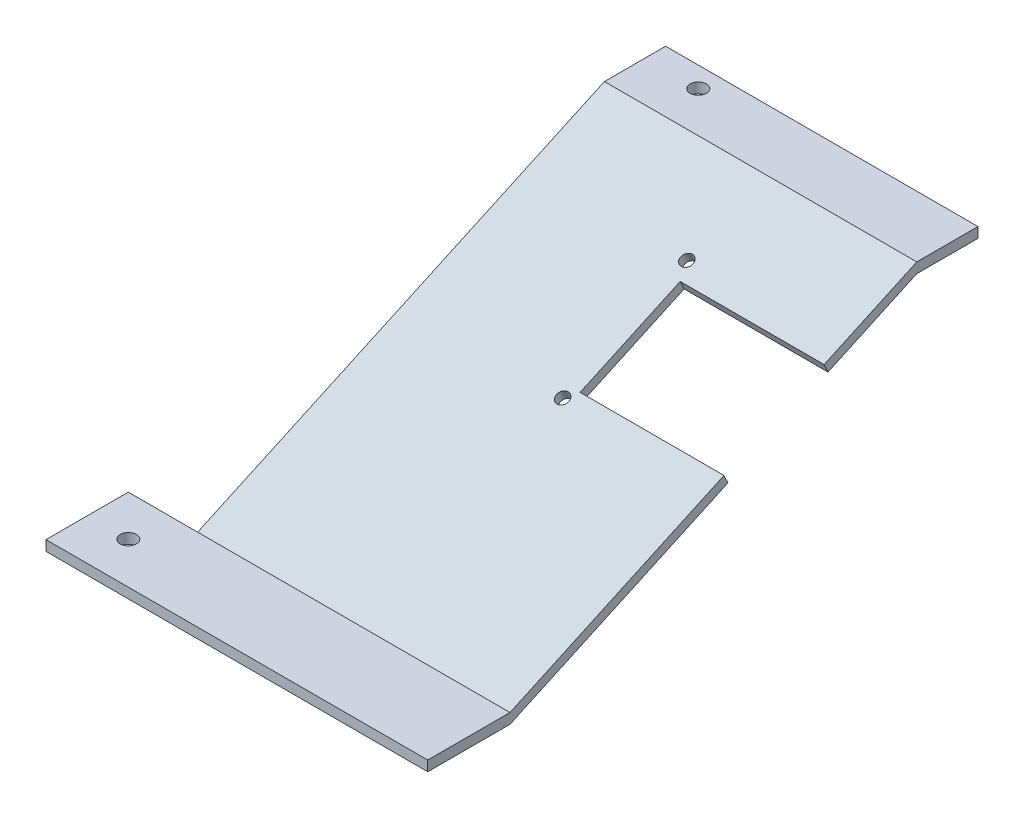
ISO-10303-21;
HEADER;
FILE_DESCRIPTION(('STEP AP214'),'2;1');
FILE_NAME('part.step','',(''),(''),'','','');
FILE_SCHEMA(('AUTOMOTIVE_DESIGN { 1 0 10303 214 1 1 1 1 }'));
ENDSEC;
DATA;
#1=APPLICATION_CONTEXT('core data for automotive mechanical design processes');
#2=APPLICATION_PROTOCOL_DEFINITION('international standard','automotive_design',2000,#1);
#3=PRODUCT_CONTEXT('',#1,'mechanical');
#4=PRODUCT('Part','Part','',(#3));
#5=PRODUCT_RELATED_PRODUCT_CATEGORY('part','',(#4));
#6=PRODUCT_DEFINITION_FORMATION('','',#4);
#7=PRODUCT_DEFINITION_CONTEXT('part definition',#1,'design');
#8=PRODUCT_DEFINITION('design','',#6,#7);
#9=PRODUCT_DEFINITION_SHAPE('','',#8);
#10=(LENGTH_UNIT() NAMED_UNIT(*) SI_UNIT(.MILLI.,.METRE.));
#11=(NAMED_UNIT(*) PLANE_ANGLE_UNIT() SI_UNIT($,.RADIAN.));
#12=(NAMED_UNIT(*) SI_UNIT($,.STERADIAN.) SOLID_ANGLE_UNIT());
#13=UNCERTAINTY_MEASURE_WITH_UNIT(LENGTH_MEASURE(1.E-05),#10,'distance_accuracy_value','');
#14=(GEOMETRIC_REPRESENTATION_CONTEXT(3) GLOBAL_UNCERTAINTY_ASSIGNED_CONTEXT((#13)) GLOBAL_UNIT_ASSIGNED_CONTEXT((#10,
#11,#12)) REPRESENTATION_CONTEXT('',''));
#15=CARTESIAN_POINT('',(0.,0.,0.));
#16=DIRECTION('',(0.,0.,1.));
#17=DIRECTION('',(1.,0.,0.));
#18=AXIS2_PLACEMENT_3D('',#15,#16,#17);
#19=CARTESIAN_POINT('',(19.,0.,0.));
#20=DIRECTION('',(1.,0.,0.));
#21=DIRECTION('',(0.,0.,-1.));
#22=AXIS2_PLACEMENT_3D('',#19,#20,#21);
#23=PLANE('',#22);
#24=DIRECTION('',(0.,-1.,0.));
#25=VECTOR('',#24,1.);
#26=CARTESIAN_POINT('',(19.,2.5,-43.8786351115675));
#27=LINE('',#26,#25);
#28=CARTESIAN_POINT('',(19.,2.5,-43.8786351115675));
#29=VERTEX_POINT('',#28);
#30=CARTESIAN_POINT('',(19.,0.,-43.8786351115675));
#31=VERTEX_POINT('',#30);
#32=EDGE_CURVE('E356',#29,#31,#27,.T.);
#33=ORIENTED_EDGE('',*,*,#32,.F.);
#34=DIRECTION('',(0.,0.,-1.));
#35=VECTOR('',#34,1.);
#36=CARTESIAN_POINT('',(19.,2.5,0.));
#37=LINE('',#36,#35);
#38=CARTESIAN_POINT('',(19.,2.5,-28.8786351115675));
#39=VERTEX_POINT('',#38);
#40=EDGE_CURVE('E158',#39,#29,#37,.T.);
#41=ORIENTED_EDGE('',*,*,#40,.F.);
#42=DIRECTION('',(0.,-0.417404580489355,0.908720758091563));
#43=VECTOR('',#42,1.);
#44=CARTESIAN_POINT('',(19.,-8.88935424437403,-4.0831654236519));
#45=LINE('',#44,#43);
#46=CARTESIAN_POINT('',(19.,-7.93511451223392,-6.16061615927836));
#47=VERTEX_POINT('',#46);
#48=EDGE_CURVE('E344',#39,#47,#45,.T.);
#49=ORIENTED_EDGE('',*,*,#48,.T.);
#50=DIRECTION('',(0.,0.908720758091563,0.417404580489355));
#51=VECTOR('',#50,1.);
#52=CARTESIAN_POINT('',(19.,-26.1095296740652,-14.5087077690655));
#53=LINE('',#52,#51);
#54=CARTESIAN_POINT('',(19.,-9.99956608186571,-7.1088849576851));
#55=VERTEX_POINT('',#54);
#56=EDGE_CURVE('E168',#55,#47,#53,.T.);
#57=ORIENTED_EDGE('',*,*,#56,.F.);
#58=DIRECTION('',(0.,-0.417405333068852,0.908720412407293));
#59=VECTOR('',#58,1.);
#60=CARTESIAN_POINT('',(19.,-10.953803367583,-5.03144408399996));
#61=LINE('',#60,#59);
#62=CARTESIAN_POINT('',(19.,0.,-28.8786351115675));
#63=VERTEX_POINT('',#62);
#64=EDGE_CURVE('E348',#63,#55,#61,.T.);
#65=ORIENTED_EDGE('',*,*,#64,.F.);
#66=DIRECTION('',(0.,0.,-1.));
#67=VECTOR('',#66,1.);
#68=CARTESIAN_POINT('',(19.,0.,0.));
#69=LINE('',#68,#67);
#70=EDGE_CURVE('E176',#63,#31,#69,.T.);
#71=ORIENTED_EDGE('',*,*,#70,.T.);
#72=EDGE_LOOP('',(#33,#41,#49,#57,#65,#71));
#73=FACE_BOUND('',#72,.T.);
#74=ADVANCED_FACE('F34',(#73),#23,.T.);
#75=CARTESIAN_POINT('',(19.,-19.2050381854465,18.3748443091939));
#76=VERTEX_POINT('',#75);
#77=CARTESIAN_POINT('',(19.,-43.3,70.8313648884325));
#78=VERTEX_POINT('',#77);
#79=EDGE_CURVE('E349',#76,#78,#45,.T.);
#80=ORIENTED_EDGE('',*,*,#79,.T.);
#81=DIRECTION('',(0.,0.,1.));
#82=VECTOR('',#81,1.);
#83=CARTESIAN_POINT('',(19.,-43.3,0.));
#84=LINE('',#83,#82);
#85=CARTESIAN_POINT('',(19.,-43.3,91.));
#86=VERTEX_POINT('',#85);
#87=EDGE_CURVE('E173',#78,#86,#84,.T.);
#88=ORIENTED_EDGE('',*,*,#87,.T.);
#89=DIRECTION('',(0.,1.,0.));
#90=VECTOR('',#89,1.);
#91=CARTESIAN_POINT('',(19.,0.,91.));
#92=LINE('',#91,#90);
#93=CARTESIAN_POINT('',(19.,-45.8001,91.));
#94=VERTEX_POINT('',#93);
#95=EDGE_CURVE('E164',#94,#86,#92,.T.);
#96=ORIENTED_EDGE('',*,*,#95,.F.);
#97=DIRECTION('',(0.,0.,1.));
#98=VECTOR('',#97,1.);
#99=CARTESIAN_POINT('',(19.,-45.8001,0.));
#100=LINE('',#99,#98);
#101=CARTESIAN_POINT('',(19.,-45.8001,70.8313648884325));
#102=VERTEX_POINT('',#101);
#103=EDGE_CURVE('E145',#102,#94,#100,.T.);
#104=ORIENTED_EDGE('',*,*,#103,.F.);
#105=CARTESIAN_POINT('',(19.,-21.2695100747286,17.4265661773202));
#106=VERTEX_POINT('',#105);
#107=EDGE_CURVE('E355',#106,#102,#61,.T.);
#108=ORIENTED_EDGE('',*,*,#107,.F.);
#109=DIRECTION('',(0.,-0.908720758091563,-0.417404580489355));
#110=VECTOR('',#109,1.);
#111=CARTESIAN_POINT('',(19.,-37.3794533472778,10.0267526994068));
#112=LINE('',#111,#110);
#113=EDGE_CURVE('E180',#76,#106,#112,.T.);
#114=ORIENTED_EDGE('',*,*,#113,.F.);
#115=EDGE_LOOP('',(#80,#88,#96,#104,#108,#114));
#116=FACE_BOUND('',#115,.T.);
#117=ADVANCED_FACE('F171',(#116),#23,.T.);
#118=CARTESIAN_POINT('',(0.,0.,91.));
#119=DIRECTION('',(0.,0.,1.));
#120=DIRECTION('',(1.,0.,0.));
#121=AXIS2_PLACEMENT_3D('',#118,#119,#120);
#122=PLANE('',#121);
#123=ORIENTED_EDGE('',*,*,#95,.T.);
#124=DIRECTION('',(-1.,0.,0.));
#125=VECTOR('',#124,1.);
#126=CARTESIAN_POINT('',(0.,-43.3,91.));
#127=LINE('',#126,#125);
#128=CARTESIAN_POINT('',(-74.5662608185419,-43.3,91.));
#129=VERTEX_POINT('',#128);
#130=EDGE_CURVE('E321',#86,#129,#127,.T.);
#131=ORIENTED_EDGE('',*,*,#130,.T.);
#132=DIRECTION('',(0.,-1.,0.));
#133=VECTOR('',#132,1.);
#134=CARTESIAN_POINT('',(-74.5662608185419,-43.3,91.));
#135=LINE('',#134,#133);
#136=CARTESIAN_POINT('',(-74.5662608185419,-45.8001,91.));
#137=VERTEX_POINT('',#136);
#138=EDGE_CURVE('E166',#129,#137,#135,.T.);
#139=ORIENTED_EDGE('',*,*,#138,.T.);
#140=DIRECTION('',(-1.,0.,0.));
#141=VECTOR('',#140,1.);
#142=CARTESIAN_POINT('',(0.,-45.8001,91.));
#143=LINE('',#142,#141);
#144=EDGE_CURVE('E149',#94,#137,#143,.T.);
#145=ORIENTED_EDGE('',*,*,#144,.F.);
#146=EDGE_LOOP('',(#123,#131,#139,#145));
#147=FACE_BOUND('',#146,.T.);
#148=ADVANCED_FACE('F162',(#147),#122,.T.);
#149=CARTESIAN_POINT('',(-18.2712608185419,-38.4229647985012,12.2985545946357));
#150=DIRECTION('',(0.,0.908720758091563,0.417404580489355));
#151=DIRECTION('',(0.,-0.417404580489355,0.908720758091563));
#152=AXIS2_PLACEMENT_3D('',#149,#150,#151);
#153=CYLINDRICAL_SURFACE('',#152,1.5);
#154=CARTESIAN_POINT('',(-18.2712608185419,-22.3130234074011,19.6983672083392));
#155=DIRECTION('',(0.,-0.908720412407293,-0.417405333068852));
#156=DIRECTION('',(0.,0.417405333068852,-0.908720412407293));
#157=AXIS2_PLACEMENT_3D('',#154,#155,#156);
#158=CIRCLE('',#157,1.5);
#159=CARTESIAN_POINT('',(-18.2712608185419,-21.6869154077978,18.3352865897283));
#160=VERTEX_POINT('',#159);
#161=EDGE_CURVE('E248',#160,#160,#158,.T.);
#162=ORIENTED_EDGE('',*,*,#161,.T.);
#163=EDGE_LOOP('',(#162));
#164=FACE_BOUND('',#163,.T.);
#165=CARTESIAN_POINT('',(-18.2712608185419,-20.2485496366699,20.6466462044228));
#166=DIRECTION('',(0.,0.908720758091563,0.417404580489355));
#167=DIRECTION('',(0.,-0.417404580489355,0.908720758091563));
#168=AXIS2_PLACEMENT_3D('',#165,#166,#167);
#169=CIRCLE('',#168,1.5);
#170=CARTESIAN_POINT('',(-18.2712608185419,-20.8746565074039,22.0097273415601));
#171=VERTEX_POINT('',#170);
#172=EDGE_CURVE('E11',#171,#171,#169,.T.);
#173=ORIENTED_EDGE('',*,*,#172,.T.);
#174=EDGE_LOOP('',(#173));
#175=FACE_BOUND('',#174,.T.);
#176=ADVANCED_FACE('F403',(#164,#175),#153,.F.);
#177=CARTESIAN_POINT('',(-18.2712608185419,-24.4399113521078,-18.1435908014317));
#178=DIRECTION('',(0.,0.908720758091563,0.417404580489355));
#179=DIRECTION('',(0.,-0.417404580489355,0.908720758091563));
#180=AXIS2_PLACEMENT_3D('',#177,#178,#179);
#181=CYLINDRICAL_SURFACE('',#180,1.5);
#182=CARTESIAN_POINT('',(-18.2712608185419,-8.32994474958973,-10.7437666073155));
#183=DIRECTION('',(0.,-0.908720412407293,-0.417405333068852));
#184=DIRECTION('',(0.,0.417405333068852,-0.908720412407293));
#185=AXIS2_PLACEMENT_3D('',#182,#183,#184);
#186=CIRCLE('',#185,1.5);
#187=CARTESIAN_POINT('',(-18.2712608185419,-7.70383674998645,-12.1068472259264));
#188=VERTEX_POINT('',#187);
#189=EDGE_CURVE('E251',#188,#188,#186,.T.);
#190=ORIENTED_EDGE('',*,*,#189,.T.);
#191=EDGE_LOOP('',(#190));
#192=FACE_BOUND('',#191,.T.);
#193=CARTESIAN_POINT('',(-18.2712608185419,-6.26549619027649,-9.7954991916446));
#194=DIRECTION('',(0.,0.908720758091563,0.417404580489355));
#195=DIRECTION('',(0.,-0.417404580489355,0.908720758091563));
#196=AXIS2_PLACEMENT_3D('',#193,#194,#195);
#197=CIRCLE('',#196,1.5);
#198=CARTESIAN_POINT('',(-18.2712608185419,-6.89160306101053,-8.43241805450726));
#199=VERTEX_POINT('',#198);
#200=EDGE_CURVE('E43',#199,#199,#197,.T.);
#201=ORIENTED_EDGE('',*,*,#200,.T.);
#202=EDGE_LOOP('',(#201));
#203=FACE_BOUND('',#202,.T.);
#204=ADVANCED_FACE('F405',(#192,#203),#181,.F.);
#205=CARTESIAN_POINT('',(-57.5662608185419,0.,0.));
#206=DIRECTION('',(-1.,0.,0.));
#207=DIRECTION('',(0.,0.,1.));
#208=AXIS2_PLACEMENT_3D('',#205,#206,#207);
#209=PLANE('',#208);
#210=DIRECTION('',(0.,1.,0.));
#211=VECTOR('',#210,1.);
#212=CARTESIAN_POINT('',(-57.5662608185419,-43.3,70.8313648884325));
#213=LINE('',#212,#211);
#214=CARTESIAN_POINT('',(-57.5662608185419,-45.8001,70.8313648884325));
#215=VERTEX_POINT('',#214);
#216=CARTESIAN_POINT('',(-57.5662608185419,-43.3,70.8313648884325));
#217=VERTEX_POINT('',#216);
#218=EDGE_CURVE('E264',#215,#217,#213,.T.);
#219=ORIENTED_EDGE('',*,*,#218,.T.);
#220=DIRECTION('',(0.,0.417404580489355,-0.908720758091563));
#221=VECTOR('',#220,1.);
#222=CARTESIAN_POINT('',(-57.5662608185419,2.49999999999998,-28.8786351115674));
#223=LINE('',#222,#221);
#224=CARTESIAN_POINT('',(-57.5662608185419,2.49999999999998,-28.8786351115674));
#225=VERTEX_POINT('',#224);
#226=EDGE_CURVE('E306',#217,#225,#223,.T.);
#227=ORIENTED_EDGE('',*,*,#226,.T.);
#228=DIRECTION('',(0.,0.,-1.));
#229=VECTOR('',#228,1.);
#230=CARTESIAN_POINT('',(-57.5662608185419,2.5,-43.8786351115675));
#231=LINE('',#230,#229);
#232=CARTESIAN_POINT('',(-57.5662608185419,2.5,-43.8786351115675));
#233=VERTEX_POINT('',#232);
#234=EDGE_CURVE('E303',#225,#233,#231,.T.);
#235=ORIENTED_EDGE('',*,*,#234,.T.);
#236=DIRECTION('',(0.,-1.,0.));
#237=VECTOR('',#236,1.);
#238=CARTESIAN_POINT('',(-57.5662608185419,0.,-43.8786351115675));
#239=LINE('',#238,#237);
#240=CARTESIAN_POINT('',(-57.5662608185419,-45.8,-43.8786351115675));
#241=VERTEX_POINT('',#240);
#242=EDGE_CURVE('E301',#233,#241,#239,.T.);
#243=ORIENTED_EDGE('',*,*,#242,.T.);
#244=DIRECTION('',(0.,-8.7176357774246E-07,0.99999999999962));
#245=VECTOR('',#244,1.);
#246=CARTESIAN_POINT('',(-57.5662608185419,-45.8001,70.8313648884325));
#247=LINE('',#246,#245);
#248=EDGE_CURVE('E297',#241,#215,#247,.T.);
#249=ORIENTED_EDGE('',*,*,#248,.T.);
#250=EDGE_LOOP('',(#219,#227,#235,#243,#249));
#251=FACE_BOUND('',#250,.T.);
#252=ADVANCED_FACE('F376',(#251),#209,.T.);
#253=CARTESIAN_POINT('',(0.,2.5,-43.8786351115675));
#254=DIRECTION('',(0.,0.,-1.));
#255=DIRECTION('',(-1.,0.,0.));
#256=AXIS2_PLACEMENT_3D('',#253,#254,#255);
#257=PLANE('',#256);
#258=DIRECTION('',(1.,0.,0.));
#259=VECTOR('',#258,1.);
#260=CARTESIAN_POINT('',(0.,2.5,-43.8786351115675));
#261=LINE('',#260,#259);
#262=EDGE_CURVE('E334',#233,#29,#261,.T.);
#263=ORIENTED_EDGE('',*,*,#262,.T.);
#264=ORIENTED_EDGE('',*,*,#32,.T.);
#265=DIRECTION('',(1.,0.,0.));
#266=VECTOR('',#265,1.);
#267=CARTESIAN_POINT('',(0.,0.,-43.8786351115675));
#268=LINE('',#267,#266);
#269=CARTESIAN_POINT('',(-54.5662608185419,0.,-43.8786351115675));
#270=VERTEX_POINT('',#269);
#271=EDGE_CURVE('E328',#270,#31,#268,.T.);
#272=ORIENTED_EDGE('',*,*,#271,.F.);
#273=DIRECTION('',(0.,-1.,0.));
#274=VECTOR('',#273,1.);
#275=CARTESIAN_POINT('',(-54.5662608185419,0.,-43.8786351115675));
#276=LINE('',#275,#274);
#277=CARTESIAN_POINT('',(-54.5662608185419,-45.8,-43.8786351115675));
#278=VERTEX_POINT('',#277);
#279=EDGE_CURVE('E252',#270,#278,#276,.T.);
#280=ORIENTED_EDGE('',*,*,#279,.T.);
#281=DIRECTION('',(1.,0.,0.));
#282=VECTOR('',#281,1.);
#283=CARTESIAN_POINT('',(-57.5662608185419,-45.8,-43.8786351115675));
#284=LINE('',#283,#282);
#285=EDGE_CURVE('E294',#241,#278,#284,.T.);
#286=ORIENTED_EDGE('',*,*,#285,.F.);
#287=ORIENTED_EDGE('',*,*,#242,.F.);
#288=EDGE_LOOP('',(#263,#264,#272,#280,#286,#287));
#289=FACE_BOUND('',#288,.T.);
#290=ADVANCED_FACE('F204',(#289),#257,.T.);
#291=CARTESIAN_POINT('',(-54.5662608185419,0.,0.));
#292=DIRECTION('',(-1.,0.,0.));
#293=DIRECTION('',(0.,0.,1.));
#294=AXIS2_PLACEMENT_3D('',#291,#292,#293);
#295=PLANE('',#294);
#296=ORIENTED_EDGE('',*,*,#279,.F.);
#297=DIRECTION('',(0.,0.,-1.));
#298=VECTOR('',#297,1.);
#299=CARTESIAN_POINT('',(-54.5662608185419,0.,0.));
#300=LINE('',#299,#298);
#301=CARTESIAN_POINT('',(-54.5662608185419,0.,-28.8786351115675));
#302=VERTEX_POINT('',#301);
#303=EDGE_CURVE('E331',#302,#270,#300,.T.);
#304=ORIENTED_EDGE('',*,*,#303,.F.);
#305=DIRECTION('',(0.,0.417405333068852,-0.908720412407293));
#306=VECTOR('',#305,1.);
#307=CARTESIAN_POINT('',(-54.5662608185419,-45.8001,70.8313648884325));
#308=LINE('',#307,#306);
#309=CARTESIAN_POINT('',(-54.5662608185419,-45.8001,70.8313648884325));
#310=VERTEX_POINT('',#309);
#311=EDGE_CURVE('E280',#310,#302,#308,.T.);
#312=ORIENTED_EDGE('',*,*,#311,.F.);
#313=DIRECTION('',(0.,-8.7176357774246E-07,0.99999999999962));
#314=VECTOR('',#313,1.);
#315=CARTESIAN_POINT('',(-54.5662608185419,-45.8001,70.8313648884325));
#316=LINE('',#315,#314);
#317=EDGE_CURVE('E261',#278,#310,#316,.T.);
#318=ORIENTED_EDGE('',*,*,#317,.F.);
#319=EDGE_LOOP('',(#296,#304,#312,#318));
#320=FACE_BOUND('',#319,.T.);
#321=ADVANCED_FACE('F202',(#320),#295,.F.);
#322=CARTESIAN_POINT('',(0.,-43.3,0.));
#323=DIRECTION('',(0.,-1.,0.));
#324=DIRECTION('',(0.,0.,-1.));
#325=AXIS2_PLACEMENT_3D('',#322,#323,#324);
#326=PLANE('',#325);
#327=CARTESIAN_POINT('',(-64.5662608185419,-43.3,80.8313648884325));
#328=DIRECTION('',(0.,-1.,0.));
#329=DIRECTION('',(0.,0.,-1.));
#330=AXIS2_PLACEMENT_3D('',#327,#328,#329);
#331=CIRCLE('',#330,2.);
#332=CARTESIAN_POINT('',(-64.5662608185419,-43.3,78.8313648884325));
#333=VERTEX_POINT('',#332);
#334=EDGE_CURVE('E289',#333,#333,#331,.T.);
#335=ORIENTED_EDGE('',*,*,#334,.T.);
#336=EDGE_LOOP('',(#335));
#337=FACE_BOUND('',#336,.T.);
#338=ORIENTED_EDGE('',*,*,#87,.F.);
#339=DIRECTION('',(1.,0.,0.));
#340=VECTOR('',#339,1.);
#341=CARTESIAN_POINT('',(94.0237391814581,-43.3,70.8313648884325));
#342=LINE('',#341,#340);
#343=CARTESIAN_POINT('',(-54.5662608185419,-43.3,70.8313648884325));
#344=VERTEX_POINT('',#343);
#345=EDGE_CURVE('E380',#344,#78,#342,.T.);
#346=ORIENTED_EDGE('',*,*,#345,.F.);
#347=DIRECTION('',(-1.,0.,0.));
#348=VECTOR('',#347,1.);
#349=CARTESIAN_POINT('',(0.,-43.3,70.8313648884325));
#350=LINE('',#349,#348);
#351=EDGE_CURVE('E268',#344,#217,#350,.T.);
#352=ORIENTED_EDGE('',*,*,#351,.T.);
#353=CARTESIAN_POINT('',(-74.5662608185419,-43.3,70.8313648884325));
#354=VERTEX_POINT('',#353);
#355=EDGE_CURVE('E265',#217,#354,#350,.T.);
#356=ORIENTED_EDGE('',*,*,#355,.T.);
#357=DIRECTION('',(0.,0.,1.));
#358=VECTOR('',#357,1.);
#359=CARTESIAN_POINT('',(-74.5662608185419,-43.3,0.));
#360=LINE('',#359,#358);
#361=EDGE_CURVE('E279',#354,#129,#360,.T.);
#362=ORIENTED_EDGE('',*,*,#361,.T.);
#363=ORIENTED_EDGE('',*,*,#130,.F.);
#364=EDGE_LOOP('',(#338,#346,#352,#356,#362,#363));
#365=FACE_BOUND('',#364,.T.);
#366=ADVANCED_FACE('F191',(#337,#365),#326,.F.);
#367=CARTESIAN_POINT('',(-57.5662608185419,-45.8001,70.8313648884325));
#368=DIRECTION('',(0.,0.99999999999962,8.7176357774246E-07));
#369=DIRECTION('',(0.,-8.7176357774246E-07,0.99999999999962));
#370=AXIS2_PLACEMENT_3D('',#367,#368,#369);
#371=PLANE('',#370);
#372=ORIENTED_EDGE('',*,*,#317,.T.);
#373=DIRECTION('',(-1.,0.,0.));
#374=VECTOR('',#373,1.);
#375=CARTESIAN_POINT('',(0.,-45.8001,70.8313648884325));
#376=LINE('',#375,#374);
#377=EDGE_CURVE('E282',#310,#215,#376,.T.);
#378=ORIENTED_EDGE('',*,*,#377,.T.);
#379=ORIENTED_EDGE('',*,*,#248,.F.);
#380=ORIENTED_EDGE('',*,*,#285,.T.);
#381=EDGE_LOOP('',(#372,#378,#379,#380));
#382=FACE_BOUND('',#381,.T.);
#383=ADVANCED_FACE('F201',(#382),#371,.F.);
#384=CARTESIAN_POINT('',(0.,-43.3,70.8313648884325));
#385=DIRECTION('',(0.,0.,1.));
#386=DIRECTION('',(1.,0.,0.));
#387=AXIS2_PLACEMENT_3D('',#384,#385,#386);
#388=PLANE('',#387);
#389=ORIENTED_EDGE('',*,*,#355,.F.);
#390=ORIENTED_EDGE('',*,*,#218,.F.);
#391=CARTESIAN_POINT('',(-74.5662608185419,-45.8001,70.8313648884325));
#392=VERTEX_POINT('',#391);
#393=EDGE_CURVE('E269',#215,#392,#376,.T.);
#394=ORIENTED_EDGE('',*,*,#393,.T.);
#395=DIRECTION('',(0.,-1.,0.));
#396=VECTOR('',#395,1.);
#397=CARTESIAN_POINT('',(-74.5662608185419,-43.3,70.8313648884325));
#398=LINE('',#397,#396);
#399=EDGE_CURVE('E286',#354,#392,#398,.T.);
#400=ORIENTED_EDGE('',*,*,#399,.F.);
#401=EDGE_LOOP('',(#389,#390,#394,#400));
#402=FACE_BOUND('',#401,.T.);
#403=ADVANCED_FACE('F206',(#402),#388,.F.);
#404=CARTESIAN_POINT('',(-74.5662608185419,-43.3,0.));
#405=DIRECTION('',(1.,0.,0.));
#406=DIRECTION('',(0.,0.,-1.));
#407=AXIS2_PLACEMENT_3D('',#404,#405,#406);
#408=PLANE('',#407);
#409=ORIENTED_EDGE('',*,*,#138,.F.);
#410=ORIENTED_EDGE('',*,*,#361,.F.);
#411=ORIENTED_EDGE('',*,*,#399,.T.);
#412=DIRECTION('',(0.,0.,1.));
#413=VECTOR('',#412,1.);
#414=CARTESIAN_POINT('',(-74.5662608185419,-45.8001,0.));
#415=LINE('',#414,#413);
#416=EDGE_CURVE('E285',#392,#137,#415,.T.);
#417=ORIENTED_EDGE('',*,*,#416,.T.);
#418=EDGE_LOOP('',(#409,#410,#411,#417));
#419=FACE_BOUND('',#418,.T.);
#420=ADVANCED_FACE('F208',(#419),#408,.F.);
#421=CARTESIAN_POINT('',(-16.2712608185419,-27.0637694062053,-12.431257033439));
#422=DIRECTION('',(1.,0.,0.));
#423=DIRECTION('',(0.,0.,-1.));
#424=AXIS2_PLACEMENT_3D('',#421,#422,#423);
#425=PLANE('',#424);
#426=DIRECTION('',(0.,0.908720758091563,0.417404580489355));
#427=VECTOR('',#426,1.);
#428=CARTESIAN_POINT('',(-16.2712608185419,-26.1095296740652,-14.5087077690655));
#429=LINE('',#428,#427);
#430=CARTESIAN_POINT('',(-16.2712608185419,-9.99956608186571,-7.10888495768509));
#431=VERTEX_POINT('',#430);
#432=CARTESIAN_POINT('',(-16.2712608185419,-7.93511451223392,-6.16061615927835));
#433=VERTEX_POINT('',#432);
#434=EDGE_CURVE('E51',#431,#433,#429,.T.);
#435=ORIENTED_EDGE('',*,*,#434,.T.);
#436=DIRECTION('',(0.,0.417404580489355,-0.908720758091563));
#437=VECTOR('',#436,1.);
#438=CARTESIAN_POINT('',(-16.2712608185419,-8.88935424437404,-4.0831654236519));
#439=LINE('',#438,#437);
#440=CARTESIAN_POINT('',(-16.2712608185419,-19.2050381854465,18.3748443091939));
#441=VERTEX_POINT('',#440);
#442=EDGE_CURVE('E315',#441,#433,#439,.T.);
#443=ORIENTED_EDGE('',*,*,#442,.F.);
#444=DIRECTION('',(0.,0.908720758091563,0.417404580489355));
#445=VECTOR('',#444,1.);
#446=CARTESIAN_POINT('',(-16.2712608185419,-37.3794533472778,10.0267526994068));
#447=LINE('',#446,#445);
#448=CARTESIAN_POINT('',(-16.2712608185419,-21.2695100747286,17.4265661773202));
#449=VERTEX_POINT('',#448);
#450=EDGE_CURVE('E311',#449,#441,#447,.T.);
#451=ORIENTED_EDGE('',*,*,#450,.F.);
#452=DIRECTION('',(0.,-0.417405333068852,0.908720412407293));
#453=VECTOR('',#452,1.);
#454=CARTESIAN_POINT('',(-16.2712608185419,-10.953803367583,-5.03144408399996));
#455=LINE('',#454,#453);
#456=EDGE_CURVE('E255',#431,#449,#455,.T.);
#457=ORIENTED_EDGE('',*,*,#456,.F.);
#458=EDGE_LOOP('',(#435,#443,#451,#457));
#459=FACE_BOUND('',#458,.T.);
#460=ADVANCED_FACE('F215',(#459),#425,.T.);
#461=CARTESIAN_POINT('',(0.,-10.953803367583,-5.03144408399996));
#462=DIRECTION('',(0.,-0.908720412407293,-0.417405333068852));
#463=DIRECTION('',(0.,0.417405333068852,-0.908720412407293));
#464=AXIS2_PLACEMENT_3D('',#461,#462,#463);
#465=PLANE('',#464);
#466=ORIENTED_EDGE('',*,*,#189,.F.);
#467=EDGE_LOOP('',(#466));
#468=FACE_BOUND('',#467,.T.);
#469=ORIENTED_EDGE('',*,*,#161,.F.);
#470=EDGE_LOOP('',(#469));
#471=FACE_BOUND('',#470,.T.);
#472=DIRECTION('',(1.,0.,0.));
#473=VECTOR('',#472,1.);
#474=CARTESIAN_POINT('',(0.,0.,-28.8786351115675));
#475=LINE('',#474,#473);
#476=EDGE_CURVE('E332',#302,#63,#475,.T.);
#477=ORIENTED_EDGE('',*,*,#476,.T.);
#478=ORIENTED_EDGE('',*,*,#64,.T.);
#479=DIRECTION('',(-1.,0.,0.));
#480=VECTOR('',#479,1.);
#481=CARTESIAN_POINT('',(0.,-9.99956608186571,-7.10888495768509));
#482=LINE('',#481,#480);
#483=EDGE_CURVE('E258',#55,#431,#482,.T.);
#484=ORIENTED_EDGE('',*,*,#483,.T.);
#485=ORIENTED_EDGE('',*,*,#456,.T.);
#486=DIRECTION('',(1.,0.,0.));
#487=VECTOR('',#486,1.);
#488=CARTESIAN_POINT('',(0.,-21.2695100747286,17.4265661773202));
#489=LINE('',#488,#487);
#490=EDGE_CURVE('E59',#449,#106,#489,.T.);
#491=ORIENTED_EDGE('',*,*,#490,.T.);
#492=ORIENTED_EDGE('',*,*,#107,.T.);
#493=DIRECTION('',(-1.,0.,0.));
#494=VECTOR('',#493,1.);
#495=CARTESIAN_POINT('',(-54.5662608185419,-45.8001,70.8313648884325));
#496=LINE('',#495,#494);
#497=EDGE_CURVE('E152',#102,#310,#496,.T.);
#498=ORIENTED_EDGE('',*,*,#497,.T.);
#499=ORIENTED_EDGE('',*,*,#311,.T.);
#500=EDGE_LOOP('',(#477,#478,#484,#485,#491,#492,#498,#499));
#501=FACE_BOUND('',#500,.T.);
#502=ADVANCED_FACE('F210',(#468,#471,#501),#465,.T.);
#503=CARTESIAN_POINT('',(0.,-8.88935424437403,-4.0831654236519));
#504=DIRECTION('',(0.,-0.908720758091563,-0.417404580489355));
#505=DIRECTION('',(0.,0.417404580489355,-0.908720758091563));
#506=AXIS2_PLACEMENT_3D('',#503,#504,#505);
#507=PLANE('',#506);
#508=ORIENTED_EDGE('',*,*,#200,.F.);
#509=EDGE_LOOP('',(#508));
#510=FACE_BOUND('',#509,.T.);
#511=ORIENTED_EDGE('',*,*,#172,.F.);
#512=EDGE_LOOP('',(#511));
#513=FACE_BOUND('',#512,.T.);
#514=ORIENTED_EDGE('',*,*,#48,.F.);
#515=DIRECTION('',(1.,0.,0.));
#516=VECTOR('',#515,1.);
#517=CARTESIAN_POINT('',(0.,2.5,-28.8786351115675));
#518=LINE('',#517,#516);
#519=EDGE_CURVE('E337',#225,#39,#518,.T.);
#520=ORIENTED_EDGE('',*,*,#519,.F.);
#521=ORIENTED_EDGE('',*,*,#226,.F.);
#522=ORIENTED_EDGE('',*,*,#351,.F.);
#523=ORIENTED_EDGE('',*,*,#345,.T.);
#524=ORIENTED_EDGE('',*,*,#79,.F.);
#525=DIRECTION('',(-1.,0.,0.));
#526=VECTOR('',#525,1.);
#527=CARTESIAN_POINT('',(0.,-19.2050381854465,18.3748443091939));
#528=LINE('',#527,#526);
#529=EDGE_CURVE('E317',#76,#441,#528,.T.);
#530=ORIENTED_EDGE('',*,*,#529,.T.);
#531=ORIENTED_EDGE('',*,*,#442,.T.);
#532=DIRECTION('',(1.,0.,0.));
#533=VECTOR('',#532,1.);
#534=CARTESIAN_POINT('',(0.,-7.93511451223392,-6.16061615927835));
#535=LINE('',#534,#533);
#536=EDGE_CURVE('E313',#433,#47,#535,.T.);
#537=ORIENTED_EDGE('',*,*,#536,.T.);
#538=EDGE_LOOP('',(#514,#520,#521,#522,#523,#524,#530,#531,#537));
#539=FACE_BOUND('',#538,.T.);
#540=ADVANCED_FACE('F214',(#510,#513,#539),#507,.F.);
#541=CARTESIAN_POINT('',(0.,-37.3794533472778,10.0267526994068));
#542=DIRECTION('',(0.,0.417404580489355,-0.908720758091563));
#543=DIRECTION('',(0.,0.908720758091563,0.417404580489355));
#544=AXIS2_PLACEMENT_3D('',#541,#542,#543);
#545=PLANE('',#544);
#546=ORIENTED_EDGE('',*,*,#529,.F.);
#547=ORIENTED_EDGE('',*,*,#113,.T.);
#548=ORIENTED_EDGE('',*,*,#490,.F.);
#549=ORIENTED_EDGE('',*,*,#450,.T.);
#550=EDGE_LOOP('',(#546,#547,#548,#549));
#551=FACE_BOUND('',#550,.T.);
#552=ADVANCED_FACE('F217',(#551),#545,.T.);
#553=CARTESIAN_POINT('',(0.,-26.1095296740652,-14.5087077690655));
#554=DIRECTION('',(0.,-0.417404580489355,0.908720758091563));
#555=DIRECTION('',(0.,-0.908720758091563,-0.417404580489355));
#556=AXIS2_PLACEMENT_3D('',#553,#554,#555);
#557=PLANE('',#556);
#558=ORIENTED_EDGE('',*,*,#483,.F.);
#559=ORIENTED_EDGE('',*,*,#56,.T.);
#560=ORIENTED_EDGE('',*,*,#536,.F.);
#561=ORIENTED_EDGE('',*,*,#434,.F.);
#562=EDGE_LOOP('',(#558,#559,#560,#561));
#563=FACE_BOUND('',#562,.T.);
#564=ADVANCED_FACE('F220',(#563),#557,.T.);
#565=CARTESIAN_POINT('',(-64.5662608185419,-43.3,80.8313648884325));
#566=DIRECTION('',(0.,-1.,0.));
#567=DIRECTION('',(0.,0.,-1.));
#568=AXIS2_PLACEMENT_3D('',#565,#566,#567);
#569=CYLINDRICAL_SURFACE('',#568,2.);
#570=ORIENTED_EDGE('',*,*,#334,.F.);
#571=EDGE_LOOP('',(#570));
#572=FACE_BOUND('',#571,.T.);
#573=CARTESIAN_POINT('',(-64.5662608185419,-45.8001,80.8313648884325));
#574=DIRECTION('',(0.,-1.,0.));
#575=DIRECTION('',(0.,0.,-1.));
#576=AXIS2_PLACEMENT_3D('',#573,#574,#575);
#577=CIRCLE('',#576,2.);
#578=CARTESIAN_POINT('',(-64.5662608185419,-45.8001,78.8313648884325));
#579=VERTEX_POINT('',#578);
#580=EDGE_CURVE('E267',#579,#579,#577,.T.);
#581=ORIENTED_EDGE('',*,*,#580,.T.);
#582=EDGE_LOOP('',(#581));
#583=FACE_BOUND('',#582,.T.);
#584=ADVANCED_FACE('F223',(#572,#583),#569,.F.);
#585=CARTESIAN_POINT('',(0.,-45.8001,0.));
#586=DIRECTION('',(0.,-1.,0.));
#587=DIRECTION('',(0.,0.,-1.));
#588=AXIS2_PLACEMENT_3D('',#585,#586,#587);
#589=PLANE('',#588);
#590=ORIENTED_EDGE('',*,*,#580,.F.);
#591=EDGE_LOOP('',(#590));
#592=FACE_BOUND('',#591,.T.);
#593=ORIENTED_EDGE('',*,*,#497,.F.);
#594=ORIENTED_EDGE('',*,*,#103,.T.);
#595=ORIENTED_EDGE('',*,*,#144,.T.);
#596=ORIENTED_EDGE('',*,*,#416,.F.);
#597=ORIENTED_EDGE('',*,*,#393,.F.);
#598=ORIENTED_EDGE('',*,*,#377,.F.);
#599=EDGE_LOOP('',(#593,#594,#595,#596,#597,#598));
#600=FACE_BOUND('',#599,.T.);
#601=ADVANCED_FACE('F147',(#592,#600),#589,.T.);
#602=CARTESIAN_POINT('',(-44.5662608185419,0.,-38.8786351115675));
#603=DIRECTION('',(0.,1.,0.));
#604=DIRECTION('',(0.,0.,1.));
#605=AXIS2_PLACEMENT_3D('',#602,#603,#604);
#606=CYLINDRICAL_SURFACE('',#605,2.);
#607=CARTESIAN_POINT('',(-44.5662608185419,0.,-38.8786351115675));
#608=DIRECTION('',(0.,1.,0.));
#609=DIRECTION('',(0.,0.,1.));
#610=AXIS2_PLACEMENT_3D('',#607,#608,#609);
#611=CIRCLE('',#610,2.);
#612=CARTESIAN_POINT('',(-44.5662608185419,0.,-36.8786351115675));
#613=VERTEX_POINT('',#612);
#614=EDGE_CURVE('E388',#613,#613,#611,.T.);
#615=ORIENTED_EDGE('',*,*,#614,.F.);
#616=EDGE_LOOP('',(#615));
#617=FACE_BOUND('',#616,.T.);
#618=CARTESIAN_POINT('',(-44.5662608185419,2.5,-38.8786351115675));
#619=DIRECTION('',(0.,1.,0.));
#620=DIRECTION('',(0.,0.,1.));
#621=AXIS2_PLACEMENT_3D('',#618,#619,#620);
#622=CIRCLE('',#621,2.);
#623=CARTESIAN_POINT('',(-44.5662608185419,2.5,-36.8786351115675));
#624=VERTEX_POINT('',#623);
#625=EDGE_CURVE('E330',#624,#624,#622,.T.);
#626=ORIENTED_EDGE('',*,*,#625,.T.);
#627=EDGE_LOOP('',(#626));
#628=FACE_BOUND('',#627,.T.);
#629=ADVANCED_FACE('F227',(#617,#628),#606,.F.);
#630=CARTESIAN_POINT('',(0.,0.,0.));
#631=DIRECTION('',(0.,1.,0.));
#632=DIRECTION('',(0.,0.,1.));
#633=AXIS2_PLACEMENT_3D('',#630,#631,#632);
#634=PLANE('',#633);
#635=ORIENTED_EDGE('',*,*,#614,.T.);
#636=EDGE_LOOP('',(#635));
#637=FACE_BOUND('',#636,.T.);
#638=ORIENTED_EDGE('',*,*,#70,.F.);
#639=ORIENTED_EDGE('',*,*,#476,.F.);
#640=ORIENTED_EDGE('',*,*,#303,.T.);
#641=ORIENTED_EDGE('',*,*,#271,.T.);
#642=EDGE_LOOP('',(#638,#639,#640,#641));
#643=FACE_BOUND('',#642,.T.);
#644=ADVANCED_FACE('F229',(#637,#643),#634,.F.);
#645=CARTESIAN_POINT('',(0.,2.5,0.));
#646=DIRECTION('',(0.,1.,0.));
#647=DIRECTION('',(0.,0.,1.));
#648=AXIS2_PLACEMENT_3D('',#645,#646,#647);
#649=PLANE('',#648);
#650=ORIENTED_EDGE('',*,*,#625,.F.);
#651=EDGE_LOOP('',(#650));
#652=FACE_BOUND('',#651,.T.);
#653=ORIENTED_EDGE('',*,*,#519,.T.);
#654=ORIENTED_EDGE('',*,*,#40,.T.);
#655=ORIENTED_EDGE('',*,*,#262,.F.);
#656=ORIENTED_EDGE('',*,*,#234,.F.);
#657=EDGE_LOOP('',(#653,#654,#655,#656));
#658=FACE_BOUND('',#657,.T.);
#659=ADVANCED_FACE('F36',(#652,#658),#649,.T.);
#660=CLOSED_SHELL('',(#74,#117,#148,#176,#204,#252,#290,#321,#366,#383,#403,#420,#460,#502,#540,
#552,#564,#584,#601,#629,#644,#659));
#661=MANIFOLD_SOLID_BREP('B2',#660);
#662=ADVANCED_BREP_SHAPE_REPRESENTATION('',(#18,#661),#14);
#663=SHAPE_DEFINITION_REPRESENTATION(#9,#662);
ENDSEC;
END-ISO-10303-21;
